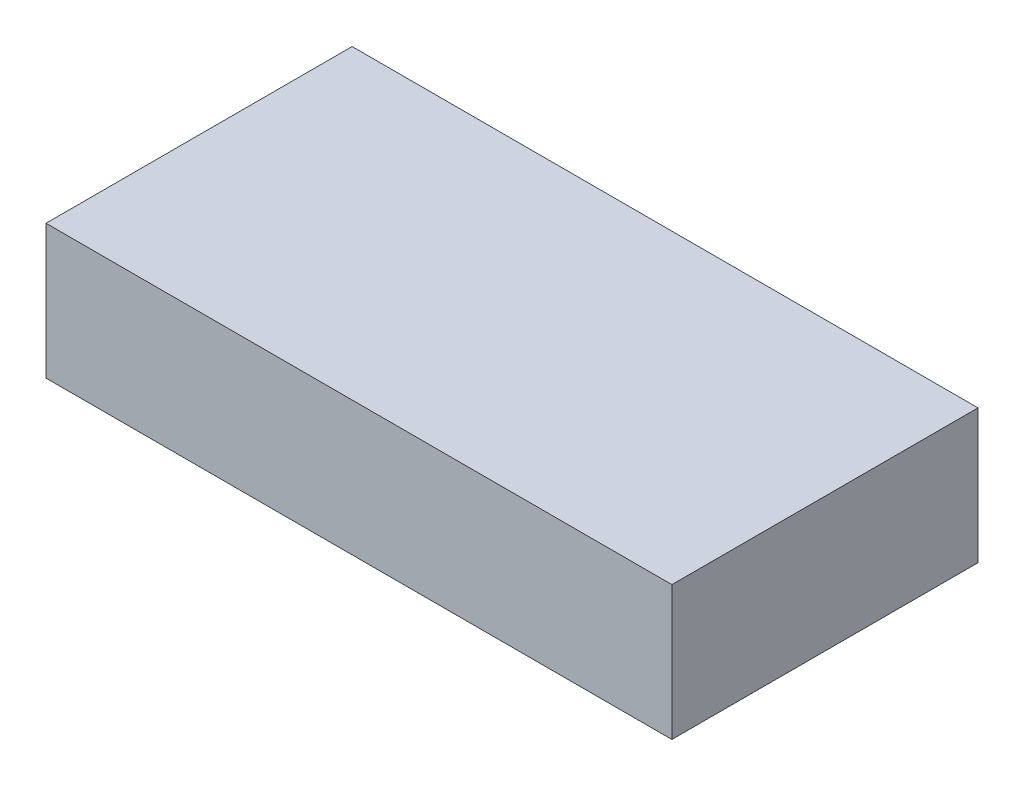
ISO-10303-21;
HEADER;
FILE_DESCRIPTION(('STEP AP214'),'2;1');
FILE_NAME('part.step','',(''),(''),'','','');
FILE_SCHEMA(('AUTOMOTIVE_DESIGN { 1 0 10303 214 1 1 1 1 }'));
ENDSEC;
DATA;
#1=APPLICATION_CONTEXT('core data for automotive mechanical design processes');
#2=APPLICATION_PROTOCOL_DEFINITION('international standard','automotive_design',2000,#1);
#3=PRODUCT_CONTEXT('',#1,'mechanical');
#4=PRODUCT('Part','Part','',(#3));
#5=PRODUCT_RELATED_PRODUCT_CATEGORY('part','',(#4));
#6=PRODUCT_DEFINITION_FORMATION('','',#4);
#7=PRODUCT_DEFINITION_CONTEXT('part definition',#1,'design');
#8=PRODUCT_DEFINITION('design','',#6,#7);
#9=PRODUCT_DEFINITION_SHAPE('','',#8);
#10=(LENGTH_UNIT() NAMED_UNIT(*) SI_UNIT(.MILLI.,.METRE.));
#11=(NAMED_UNIT(*) PLANE_ANGLE_UNIT() SI_UNIT($,.RADIAN.));
#12=(NAMED_UNIT(*) SI_UNIT($,.STERADIAN.) SOLID_ANGLE_UNIT());
#13=UNCERTAINTY_MEASURE_WITH_UNIT(LENGTH_MEASURE(1.E-05),#10,'distance_accuracy_value','');
#14=(GEOMETRIC_REPRESENTATION_CONTEXT(3) GLOBAL_UNCERTAINTY_ASSIGNED_CONTEXT((#13)) GLOBAL_UNIT_ASSIGNED_CONTEXT((#10,
#11,#12)) REPRESENTATION_CONTEXT('',''));
#15=CARTESIAN_POINT('',(0.,0.,0.));
#16=DIRECTION('',(0.,0.,1.));
#17=DIRECTION('',(1.,0.,0.));
#18=AXIS2_PLACEMENT_3D('',#15,#16,#17);
#19=CARTESIAN_POINT('',(0.,15.,0.));
#20=DIRECTION('',(1.,0.,0.));
#21=DIRECTION('',(0.,0.,-1.));
#22=AXIS2_PLACEMENT_3D('',#19,#20,#21);
#23=PLANE('',#22);
#24=DIRECTION('',(0.,0.,1.));
#25=VECTOR('',#24,1.);
#26=CARTESIAN_POINT('',(0.,0.,0.));
#27=LINE('',#26,#25);
#28=CARTESIAN_POINT('',(0.,0.,-34.2367601246105));
#29=VERTEX_POINT('',#28);
#30=CARTESIAN_POINT('',(0.,0.,0.));
#31=VERTEX_POINT('',#30);
#32=EDGE_CURVE('E96',#29,#31,#27,.T.);
#33=ORIENTED_EDGE('',*,*,#32,.T.);
#34=DIRECTION('',(0.,-1.,0.));
#35=VECTOR('',#34,1.);
#36=CARTESIAN_POINT('',(0.,15.,0.));
#37=LINE('',#36,#35);
#38=CARTESIAN_POINT('',(0.,15.,0.));
#39=VERTEX_POINT('',#38);
#40=EDGE_CURVE('E11',#39,#31,#37,.T.);
#41=ORIENTED_EDGE('',*,*,#40,.F.);
#42=DIRECTION('',(0.,0.,1.));
#43=VECTOR('',#42,1.);
#44=CARTESIAN_POINT('',(0.,15.,0.));
#45=LINE('',#44,#43);
#46=CARTESIAN_POINT('',(0.,15.,-34.2367601246105));
#47=VERTEX_POINT('',#46);
#48=EDGE_CURVE('E84',#47,#39,#45,.T.);
#49=ORIENTED_EDGE('',*,*,#48,.F.);
#50=DIRECTION('',(0.,-1.,0.));
#51=VECTOR('',#50,1.);
#52=CARTESIAN_POINT('',(0.,15.,-34.2367601246105));
#53=LINE('',#52,#51);
#54=EDGE_CURVE('E92',#47,#29,#53,.T.);
#55=ORIENTED_EDGE('',*,*,#54,.T.);
#56=EDGE_LOOP('',(#33,#41,#49,#55));
#57=FACE_BOUND('',#56,.T.);
#58=ADVANCED_FACE('F33',(#57),#23,.F.);
#59=CARTESIAN_POINT('',(0.,15.,0.));
#60=DIRECTION('',(0.,0.,-1.));
#61=DIRECTION('',(-1.,0.,0.));
#62=AXIS2_PLACEMENT_3D('',#59,#60,#61);
#63=PLANE('',#62);
#64=DIRECTION('',(1.,0.,0.));
#65=VECTOR('',#64,1.);
#66=CARTESIAN_POINT('',(0.,0.,0.));
#67=LINE('',#66,#65);
#68=CARTESIAN_POINT('',(70.,0.,0.));
#69=VERTEX_POINT('',#68);
#70=EDGE_CURVE('E88',#31,#69,#67,.T.);
#71=ORIENTED_EDGE('',*,*,#70,.T.);
#72=DIRECTION('',(0.,-1.,0.));
#73=VECTOR('',#72,1.);
#74=CARTESIAN_POINT('',(70.,15.,0.));
#75=LINE('',#74,#73);
#76=CARTESIAN_POINT('',(70.,15.,0.));
#77=VERTEX_POINT('',#76);
#78=EDGE_CURVE('E41',#77,#69,#75,.T.);
#79=ORIENTED_EDGE('',*,*,#78,.F.);
#80=DIRECTION('',(1.,0.,0.));
#81=VECTOR('',#80,1.);
#82=CARTESIAN_POINT('',(0.,15.,0.));
#83=LINE('',#82,#81);
#84=EDGE_CURVE('E79',#39,#77,#83,.T.);
#85=ORIENTED_EDGE('',*,*,#84,.F.);
#86=ORIENTED_EDGE('',*,*,#40,.T.);
#87=EDGE_LOOP('',(#71,#79,#85,#86));
#88=FACE_BOUND('',#87,.T.);
#89=ADVANCED_FACE('F87',(#88),#63,.F.);
#90=CARTESIAN_POINT('',(70.,15.,0.));
#91=DIRECTION('',(-1.,0.,0.));
#92=DIRECTION('',(0.,0.,1.));
#93=AXIS2_PLACEMENT_3D('',#90,#91,#92);
#94=PLANE('',#93);
#95=DIRECTION('',(0.,0.,-1.));
#96=VECTOR('',#95,1.);
#97=CARTESIAN_POINT('',(70.,0.,0.));
#98=LINE('',#97,#96);
#99=CARTESIAN_POINT('',(70.,0.,-34.2367601246105));
#100=VERTEX_POINT('',#99);
#101=EDGE_CURVE('E66',#69,#100,#98,.T.);
#102=ORIENTED_EDGE('',*,*,#101,.T.);
#103=DIRECTION('',(0.,-1.,0.));
#104=VECTOR('',#103,1.);
#105=CARTESIAN_POINT('',(70.,15.,-34.2367601246105));
#106=LINE('',#105,#104);
#107=CARTESIAN_POINT('',(70.,15.,-34.2367601246105));
#108=VERTEX_POINT('',#107);
#109=EDGE_CURVE('E89',#108,#100,#106,.T.);
#110=ORIENTED_EDGE('',*,*,#109,.F.);
#111=DIRECTION('',(0.,0.,-1.));
#112=VECTOR('',#111,1.);
#113=CARTESIAN_POINT('',(70.,15.,0.));
#114=LINE('',#113,#112);
#115=EDGE_CURVE('E82',#77,#108,#114,.T.);
#116=ORIENTED_EDGE('',*,*,#115,.F.);
#117=ORIENTED_EDGE('',*,*,#78,.T.);
#118=EDGE_LOOP('',(#102,#110,#116,#117));
#119=FACE_BOUND('',#118,.T.);
#120=ADVANCED_FACE('F90',(#119),#94,.F.);
#121=CARTESIAN_POINT('',(0.,15.,-34.2367601246105));
#122=DIRECTION('',(0.,0.,1.));
#123=DIRECTION('',(1.,0.,0.));
#124=AXIS2_PLACEMENT_3D('',#121,#122,#123);
#125=PLANE('',#124);
#126=DIRECTION('',(-1.,0.,0.));
#127=VECTOR('',#126,1.);
#128=CARTESIAN_POINT('',(0.,0.,-34.2367601246105));
#129=LINE('',#128,#127);
#130=EDGE_CURVE('E72',#100,#29,#129,.T.);
#131=ORIENTED_EDGE('',*,*,#130,.T.);
#132=ORIENTED_EDGE('',*,*,#54,.F.);
#133=DIRECTION('',(-1.,0.,0.));
#134=VECTOR('',#133,1.);
#135=CARTESIAN_POINT('',(0.,15.,-34.2367601246105));
#136=LINE('',#135,#134);
#137=EDGE_CURVE('E49',#108,#47,#136,.T.);
#138=ORIENTED_EDGE('',*,*,#137,.F.);
#139=ORIENTED_EDGE('',*,*,#109,.T.);
#140=EDGE_LOOP('',(#131,#132,#138,#139));
#141=FACE_BOUND('',#140,.T.);
#142=ADVANCED_FACE('F103',(#141),#125,.F.);
#143=CARTESIAN_POINT('',(0.,15.,0.));
#144=DIRECTION('',(0.,-1.,0.));
#145=DIRECTION('',(0.,0.,-1.));
#146=AXIS2_PLACEMENT_3D('',#143,#144,#145);
#147=PLANE('',#146);
#148=ORIENTED_EDGE('',*,*,#48,.T.);
#149=ORIENTED_EDGE('',*,*,#84,.T.);
#150=ORIENTED_EDGE('',*,*,#115,.T.);
#151=ORIENTED_EDGE('',*,*,#137,.T.);
#152=EDGE_LOOP('',(#148,#149,#150,#151));
#153=FACE_BOUND('',#152,.T.);
#154=ADVANCED_FACE('F80',(#153),#147,.F.);
#155=CARTESIAN_POINT('',(0.,0.,0.));
#156=DIRECTION('',(0.,-1.,0.));
#157=DIRECTION('',(0.,0.,-1.));
#158=AXIS2_PLACEMENT_3D('',#155,#156,#157);
#159=PLANE('',#158);
#160=ORIENTED_EDGE('',*,*,#32,.F.);
#161=ORIENTED_EDGE('',*,*,#130,.F.);
#162=ORIENTED_EDGE('',*,*,#101,.F.);
#163=ORIENTED_EDGE('',*,*,#70,.F.);
#164=EDGE_LOOP('',(#160,#161,#162,#163));
#165=FACE_BOUND('',#164,.T.);
#166=ADVANCED_FACE('F106',(#165),#159,.T.);
#167=CLOSED_SHELL('',(#58,#89,#120,#142,#154,#166));
#168=MANIFOLD_SOLID_BREP('B2',#167);
#169=ADVANCED_BREP_SHAPE_REPRESENTATION('',(#18,#168),#14);
#170=SHAPE_DEFINITION_REPRESENTATION(#9,#169);
ENDSEC;
END-ISO-10303-21;
